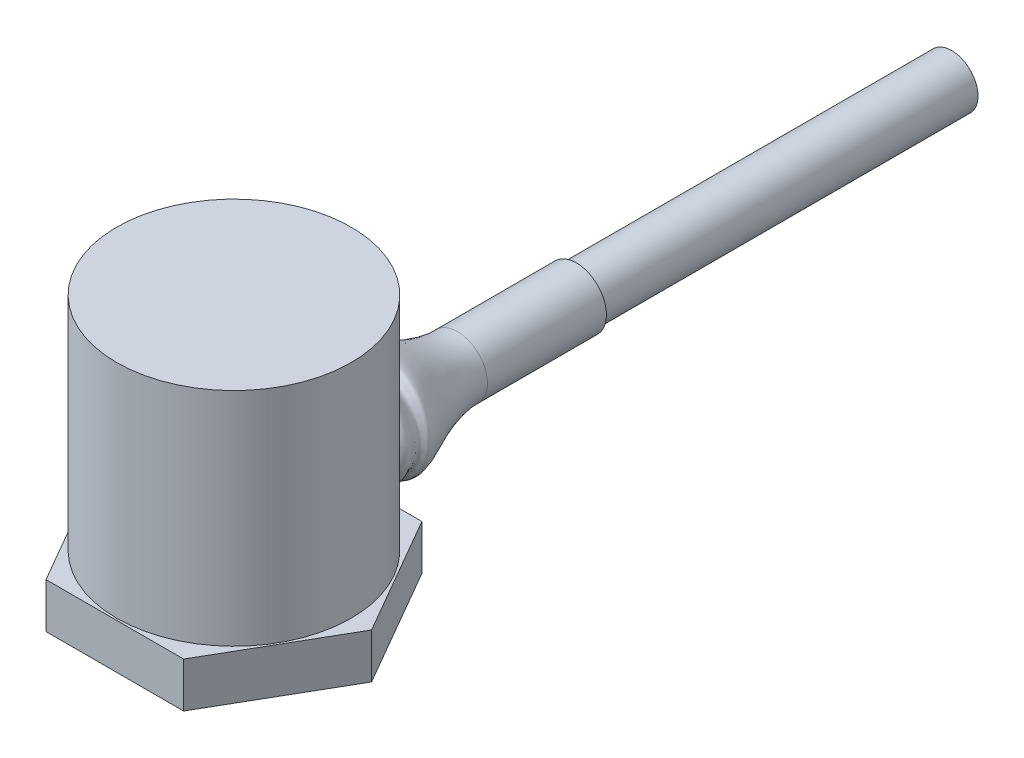
ISO-10303-21;
HEADER;
FILE_DESCRIPTION(('STEP AP214'),'2;1');
FILE_NAME('part.step','',(''),(''),'','','');
FILE_SCHEMA(('AUTOMOTIVE_DESIGN { 1 0 10303 214 1 1 1 1 }'));
ENDSEC;
DATA;
#1=APPLICATION_CONTEXT('core data for automotive mechanical design processes');
#2=APPLICATION_PROTOCOL_DEFINITION('international standard','automotive_design',2000,#1);
#3=PRODUCT_CONTEXT('',#1,'mechanical');
#4=PRODUCT('Part','Part','',(#3));
#5=PRODUCT_RELATED_PRODUCT_CATEGORY('part','',(#4));
#6=PRODUCT_DEFINITION_FORMATION('','',#4);
#7=PRODUCT_DEFINITION_CONTEXT('part definition',#1,'design');
#8=PRODUCT_DEFINITION('design','',#6,#7);
#9=PRODUCT_DEFINITION_SHAPE('','',#8);
#10=(LENGTH_UNIT() NAMED_UNIT(*) SI_UNIT(.MILLI.,.METRE.));
#11=(NAMED_UNIT(*) PLANE_ANGLE_UNIT() SI_UNIT($,.RADIAN.));
#12=(NAMED_UNIT(*) SI_UNIT($,.STERADIAN.) SOLID_ANGLE_UNIT());
#13=UNCERTAINTY_MEASURE_WITH_UNIT(LENGTH_MEASURE(1.E-05),#10,'distance_accuracy_value','');
#14=(GEOMETRIC_REPRESENTATION_CONTEXT(3) GLOBAL_UNCERTAINTY_ASSIGNED_CONTEXT((#13)) GLOBAL_UNIT_ASSIGNED_CONTEXT((#10,
#11,#12)) REPRESENTATION_CONTEXT('',''));
#15=CARTESIAN_POINT('',(0.,0.,0.));
#16=DIRECTION('',(0.,0.,1.));
#17=DIRECTION('',(1.,0.,0.));
#18=AXIS2_PLACEMENT_3D('',#15,#16,#17);
#19=CARTESIAN_POINT('',(0.,0.,-9.125));
#20=DIRECTION('',(0.,0.,1.));
#21=DIRECTION('',(1.,0.,0.));
#22=AXIS2_PLACEMENT_3D('',#19,#20,#21);
#23=PLANE('',#22);
#24=CARTESIAN_POINT('',(0.,2.475,-9.125));
#25=DIRECTION('',(0.,0.,1.));
#26=DIRECTION('',(1.,0.,0.));
#27=AXIS2_PLACEMENT_3D('',#24,#25,#26);
#28=CIRCLE('',#27,0.8);
#29=CARTESIAN_POINT('',(0.8,2.475,-9.125));
#30=VERTEX_POINT('',#29);
#31=EDGE_CURVE('E55',#30,#30,#28,.T.);
#32=ORIENTED_EDGE('',*,*,#31,.F.);
#33=EDGE_LOOP('',(#32));
#34=FACE_BOUND('',#33,.T.);
#35=CARTESIAN_POINT('',(0.,2.475,-9.125));
#36=DIRECTION('',(0.,0.,1.));
#37=DIRECTION('',(1.,0.,0.));
#38=AXIS2_PLACEMENT_3D('',#35,#36,#37);
#39=CIRCLE('',#38,0.7);
#40=CARTESIAN_POINT('',(0.7,2.475,-9.125));
#41=VERTEX_POINT('',#40);
#42=EDGE_CURVE('E11',#41,#41,#39,.F.);
#43=ORIENTED_EDGE('',*,*,#42,.F.);
#44=EDGE_LOOP('',(#43));
#45=FACE_BOUND('',#44,.T.);
#46=ADVANCED_FACE('F40',(#34,#45),#23,.F.);
#47=CARTESIAN_POINT('',(0.,2.475,-2.625));
#48=DIRECTION('',(0.,0.,1.));
#49=DIRECTION('',(1.,0.,0.));
#50=AXIS2_PLACEMENT_3D('',#47,#48,#49);
#51=CYLINDRICAL_SURFACE('',#50,1.275);
#52=CARTESIAN_POINT('',(0.,2.475,-3.125));
#53=DIRECTION('',(0.,0.,1.));
#54=DIRECTION('',(1.,0.,0.));
#55=AXIS2_PLACEMENT_3D('',#52,#53,#54);
#56=CIRCLE('',#55,1.275);
#57=CARTESIAN_POINT('',(1.275,2.475,-3.125));
#58=VERTEX_POINT('',#57);
#59=EDGE_CURVE('E47',#58,#58,#56,.T.);
#60=ORIENTED_EDGE('',*,*,#59,.T.);
#61=EDGE_LOOP('',(#60));
#62=FACE_BOUND('',#61,.T.);
#63=CARTESIAN_POINT('',(0.,2.475,-2.625));
#64=DIRECTION('',(0.,0.,1.));
#65=DIRECTION('',(1.,0.,0.));
#66=AXIS2_PLACEMENT_3D('',#63,#64,#65);
#67=CIRCLE('',#66,1.275);
#68=CARTESIAN_POINT('',(1.275,2.475,-2.625));
#69=VERTEX_POINT('',#68);
#70=EDGE_CURVE('E60',#69,#69,#67,.T.);
#71=ORIENTED_EDGE('',*,*,#70,.F.);
#72=EDGE_LOOP('',(#71));
#73=FACE_BOUND('',#72,.T.);
#74=ADVANCED_FACE('F42',(#62,#73),#51,.T.);
#75=CARTESIAN_POINT('',(0.,1.2,-3.125));
#76=CARTESIAN_POINT('',(0.,0.994577387408718,-3.30234172585024));
#77=CARTESIAN_POINT('',(0.,1.21280237493351,-3.43097267636331));
#78=CARTESIAN_POINT('',(0.,1.22107277897692,-3.71726330997462));
#79=CARTESIAN_POINT('',(0.,1.03747550346476,-3.75964524205374));
#80=CARTESIAN_POINT('',(0.,1.08981270276329,-4.02532274607695));
#81=CARTESIAN_POINT('',(0.,1.37340144468557,-4.67233424969552));
#82=CARTESIAN_POINT('',(0.,1.69183302924269,-5.36931226912087));
#83=CARTESIAN_POINT('',(0.,1.675,-5.95468658242071));
#84=B_SPLINE_CURVE_WITH_KNOTS('',3,(#75,#76,#77,#78,#79,#80,#81,#82,#83),.UNSPECIFIED.,.F.,.F.,
(4,1,1,1,1,1,4),(0.,0.1618892965205,0.198271220272997,0.247726197309799,0.302592126403118,
0.419245189738001,1.),.UNSPECIFIED.);
#85=CARTESIAN_POINT('',(0.,2.475,-2.625));
#86=DIRECTION('',(0.,0.,1.));
#87=AXIS1_PLACEMENT('',#85,#86);
#88=SURFACE_OF_REVOLUTION('',#84,#87);
#89=CARTESIAN_POINT('',(0.,2.475,-5.95468658242071));
#90=DIRECTION('',(0.,0.,1.));
#91=DIRECTION('',(1.,0.,0.));
#92=AXIS2_PLACEMENT_3D('',#89,#90,#91);
#93=CIRCLE('',#92,0.8);
#94=CARTESIAN_POINT('',(0.8,2.475,-5.95468658242071));
#95=VERTEX_POINT('',#94);
#96=EDGE_CURVE('E51',#95,#95,#93,.T.);
#97=ORIENTED_EDGE('',*,*,#96,.T.);
#98=EDGE_LOOP('',(#97));
#99=FACE_BOUND('',#98,.T.);
#100=ORIENTED_EDGE('',*,*,#59,.F.);
#101=EDGE_LOOP('',(#100));
#102=FACE_BOUND('',#101,.T.);
#103=ADVANCED_FACE('F71',(#99,#102),#88,.F.);
#104=CARTESIAN_POINT('',(0.,2.475,-2.625));
#105=DIRECTION('',(0.,0.,1.));
#106=DIRECTION('',(1.,0.,0.));
#107=AXIS2_PLACEMENT_3D('',#104,#105,#106);
#108=CYLINDRICAL_SURFACE('',#107,0.8);
#109=ORIENTED_EDGE('',*,*,#31,.T.);
#110=EDGE_LOOP('',(#109));
#111=FACE_BOUND('',#110,.T.);
#112=ORIENTED_EDGE('',*,*,#96,.F.);
#113=EDGE_LOOP('',(#112));
#114=FACE_BOUND('',#113,.T.);
#115=ADVANCED_FACE('F74',(#111,#114),#108,.T.);
#116=CARTESIAN_POINT('',(0.,0.,-2.625));
#117=DIRECTION('',(0.,0.,-1.));
#118=DIRECTION('',(-1.,0.,0.));
#119=AXIS2_PLACEMENT_3D('',#116,#117,#118);
#120=PLANE('',#119);
#121=ORIENTED_EDGE('',*,*,#70,.T.);
#122=EDGE_LOOP('',(#121));
#123=FACE_BOUND('',#122,.T.);
#124=ADVANCED_FACE('F78',(#123),#120,.F.);
#125=CARTESIAN_POINT('',(0.,2.475,-19.125));
#126=DIRECTION('',(0.,0.,1.));
#127=DIRECTION('',(1.,0.,0.));
#128=AXIS2_PLACEMENT_3D('',#125,#126,#127);
#129=CYLINDRICAL_SURFACE('',#128,0.7);
#130=CARTESIAN_POINT('',(0.,2.475,-19.125));
#131=DIRECTION('',(0.,0.,-1.));
#132=DIRECTION('',(-1.,0.,0.));
#133=AXIS2_PLACEMENT_3D('',#130,#131,#132);
#134=CIRCLE('',#133,0.7);
#135=CARTESIAN_POINT('',(-0.7,2.475,-19.125));
#136=VERTEX_POINT('',#135);
#137=EDGE_CURVE('E63',#136,#136,#134,.T.);
#138=ORIENTED_EDGE('',*,*,#137,.F.);
#139=EDGE_LOOP('',(#138));
#140=FACE_BOUND('',#139,.T.);
#141=ORIENTED_EDGE('',*,*,#42,.T.);
#142=EDGE_LOOP('',(#141));
#143=FACE_BOUND('',#142,.T.);
#144=ADVANCED_FACE('F85',(#140,#143),#129,.T.);
#145=CARTESIAN_POINT('',(0.,2.475,-19.125));
#146=DIRECTION('',(0.,0.,-1.));
#147=DIRECTION('',(-1.,0.,0.));
#148=AXIS2_PLACEMENT_3D('',#145,#146,#147);
#149=PLANE('',#148);
#150=ORIENTED_EDGE('',*,*,#137,.T.);
#151=EDGE_LOOP('',(#150));
#152=FACE_BOUND('',#151,.T.);
#153=ADVANCED_FACE('F89',(#152),#149,.T.);
#154=CLOSED_SHELL('',(#46,#74,#103,#115,#124,#144,#153));
#155=MANIFOLD_SOLID_BREP('B2',#154);
#156=CARTESIAN_POINT('',(0.,1.2,0.));
#157=DIRECTION('',(0.,1.,0.));
#158=DIRECTION('',(0.,0.,1.));
#159=AXIS2_PLACEMENT_3D('',#156,#157,#158);
#160=PLANE('',#159);
#161=DIRECTION('',(-0.499999999999992,0.,-0.866025403784443));
#162=VECTOR('',#161,1.);
#163=CARTESIAN_POINT('',(-2.74963065701561,1.2,1.58749999999997));
#164=LINE('',#163,#162);
#165=CARTESIAN_POINT('',(-1.83308710467708,1.2,3.175));
#166=VERTEX_POINT('',#165);
#167=CARTESIAN_POINT('',(-3.66617420935412,1.2,0.));
#168=VERTEX_POINT('',#167);
#169=EDGE_CURVE('E244',#166,#168,#164,.T.);
#170=ORIENTED_EDGE('',*,*,#169,.F.);
#171=DIRECTION('',(-1.,0.,0.));
#172=VECTOR('',#171,1.);
#173=CARTESIAN_POINT('',(0.,1.2,3.175));
#174=LINE('',#173,#172);
#175=CARTESIAN_POINT('',(1.83308710467705,1.2,3.175));
#176=VERTEX_POINT('',#175);
#177=EDGE_CURVE('E288',#176,#166,#174,.T.);
#178=ORIENTED_EDGE('',*,*,#177,.F.);
#179=DIRECTION('',(-0.500000000000004,0.,0.866025403784436));
#180=VECTOR('',#179,1.);
#181=CARTESIAN_POINT('',(2.74963065701559,1.2,1.58750000000001));
#182=LINE('',#181,#180);
#183=CARTESIAN_POINT('',(3.66617420935413,1.2,0.));
#184=VERTEX_POINT('',#183);
#185=EDGE_CURVE('E221',#184,#176,#182,.T.);
#186=ORIENTED_EDGE('',*,*,#185,.F.);
#187=DIRECTION('',(0.499999999999998,0.,0.86602540378444));
#188=VECTOR('',#187,1.);
#189=CARTESIAN_POINT('',(2.7496306570156,1.2,-1.58749999999999));
#190=LINE('',#189,#188);
#191=CARTESIAN_POINT('',(1.83308710467707,1.2,-3.175));
#192=VERTEX_POINT('',#191);
#193=EDGE_CURVE('E205',#192,#184,#190,.T.);
#194=ORIENTED_EDGE('',*,*,#193,.F.);
#195=DIRECTION('',(1.,0.,0.));
#196=VECTOR('',#195,1.);
#197=CARTESIAN_POINT('',(0.,1.2,-3.175));
#198=LINE('',#197,#196);
#199=CARTESIAN_POINT('',(-1.83308710467704,1.2,-3.175));
#200=VERTEX_POINT('',#199);
#201=EDGE_CURVE('E218',#200,#192,#198,.T.);
#202=ORIENTED_EDGE('',*,*,#201,.F.);
#203=DIRECTION('',(0.50000000000001,0.,-0.866025403784433));
#204=VECTOR('',#203,1.);
#205=CARTESIAN_POINT('',(-2.74963065701557,1.2,-1.58750000000003));
#206=LINE('',#205,#204);
#207=EDGE_CURVE('E224',#168,#200,#206,.T.);
#208=ORIENTED_EDGE('',*,*,#207,.F.);
#209=EDGE_LOOP('',(#170,#178,#186,#194,#202,#208));
#210=FACE_BOUND('',#209,.T.);
#211=CARTESIAN_POINT('',(0.,1.2,0.));
#212=DIRECTION('',(0.,1.,0.));
#213=DIRECTION('',(0.,0.,1.));
#214=AXIS2_PLACEMENT_3D('',#211,#212,#213);
#215=CIRCLE('',#214,3.125);
#216=CARTESIAN_POINT('',(0.,1.2,3.125));
#217=VERTEX_POINT('',#216);
#218=EDGE_CURVE('E282',#217,#217,#215,.T.);
#219=ORIENTED_EDGE('',*,*,#218,.F.);
#220=EDGE_LOOP('',(#219));
#221=FACE_BOUND('',#220,.T.);
#222=ADVANCED_FACE('F147',(#210,#221),#160,.T.);
#223=CARTESIAN_POINT('',(-2.74963065701561,1.2,1.58749999999997));
#224=DIRECTION('',(-0.866025403784443,0.,0.499999999999992));
#225=DIRECTION('',(0.499999999999992,0.,0.866025403784443));
#226=AXIS2_PLACEMENT_3D('',#223,#224,#225);
#227=PLANE('',#226);
#228=DIRECTION('',(-0.499999999999992,0.,-0.866025403784443));
#229=VECTOR('',#228,1.);
#230=CARTESIAN_POINT('',(-2.74963065701561,0.,1.58749999999997));
#231=LINE('',#230,#229);
#232=CARTESIAN_POINT('',(-1.83308710467708,0.,3.175));
#233=VERTEX_POINT('',#232);
#234=CARTESIAN_POINT('',(-3.66617420935412,0.,0.));
#235=VERTEX_POINT('',#234);
#236=EDGE_CURVE('E229',#233,#235,#231,.T.);
#237=ORIENTED_EDGE('',*,*,#236,.F.);
#238=DIRECTION('',(0.,-1.,0.));
#239=VECTOR('',#238,1.);
#240=CARTESIAN_POINT('',(-1.83308710467708,1.2,3.175));
#241=LINE('',#240,#239);
#242=EDGE_CURVE('E38',#166,#233,#241,.T.);
#243=ORIENTED_EDGE('',*,*,#242,.F.);
#244=ORIENTED_EDGE('',*,*,#169,.T.);
#245=DIRECTION('',(0.,-1.,0.));
#246=VECTOR('',#245,1.);
#247=CARTESIAN_POINT('',(-3.66617420935412,1.2,0.));
#248=LINE('',#247,#246);
#249=EDGE_CURVE('E164',#168,#235,#248,.T.);
#250=ORIENTED_EDGE('',*,*,#249,.T.);
#251=EDGE_LOOP('',(#237,#243,#244,#250));
#252=FACE_BOUND('',#251,.T.);
#253=ADVANCED_FACE('F149',(#252),#227,.T.);
#254=CARTESIAN_POINT('',(0.,1.2,3.175));
#255=DIRECTION('',(0.,0.,1.));
#256=DIRECTION('',(1.,0.,0.));
#257=AXIS2_PLACEMENT_3D('',#254,#255,#256);
#258=PLANE('',#257);
#259=DIRECTION('',(-1.,0.,0.));
#260=VECTOR('',#259,1.);
#261=CARTESIAN_POINT('',(0.,0.,3.175));
#262=LINE('',#261,#260);
#263=CARTESIAN_POINT('',(1.83308710467705,0.,3.175));
#264=VERTEX_POINT('',#263);
#265=EDGE_CURVE('E231',#264,#233,#262,.T.);
#266=ORIENTED_EDGE('',*,*,#265,.F.);
#267=DIRECTION('',(0.,-1.,0.));
#268=VECTOR('',#267,1.);
#269=CARTESIAN_POINT('',(1.83308710467705,1.2,3.175));
#270=LINE('',#269,#268);
#271=EDGE_CURVE('E156',#176,#264,#270,.T.);
#272=ORIENTED_EDGE('',*,*,#271,.F.);
#273=ORIENTED_EDGE('',*,*,#177,.T.);
#274=ORIENTED_EDGE('',*,*,#242,.T.);
#275=EDGE_LOOP('',(#266,#272,#273,#274));
#276=FACE_BOUND('',#275,.T.);
#277=ADVANCED_FACE('F253',(#276),#258,.T.);
#278=CARTESIAN_POINT('',(2.74963065701559,1.2,1.58750000000001));
#279=DIRECTION('',(0.866025403784436,0.,0.500000000000004));
#280=DIRECTION('',(0.500000000000004,0.,-0.866025403784436));
#281=AXIS2_PLACEMENT_3D('',#278,#279,#280);
#282=PLANE('',#281);
#283=DIRECTION('',(-0.500000000000004,0.,0.866025403784436));
#284=VECTOR('',#283,1.);
#285=CARTESIAN_POINT('',(2.74963065701559,0.,1.58750000000001));
#286=LINE('',#285,#284);
#287=CARTESIAN_POINT('',(3.66617420935413,0.,0.));
#288=VERTEX_POINT('',#287);
#289=EDGE_CURVE('E235',#288,#264,#286,.T.);
#290=ORIENTED_EDGE('',*,*,#289,.F.);
#291=DIRECTION('',(0.,-1.,0.));
#292=VECTOR('',#291,1.);
#293=CARTESIAN_POINT('',(3.66617420935413,1.2,0.));
#294=LINE('',#293,#292);
#295=EDGE_CURVE('E211',#184,#288,#294,.T.);
#296=ORIENTED_EDGE('',*,*,#295,.F.);
#297=ORIENTED_EDGE('',*,*,#185,.T.);
#298=ORIENTED_EDGE('',*,*,#271,.T.);
#299=EDGE_LOOP('',(#290,#296,#297,#298));
#300=FACE_BOUND('',#299,.T.);
#301=ADVANCED_FACE('F250',(#300),#282,.T.);
#302=CARTESIAN_POINT('',(2.7496306570156,1.2,-1.58749999999999));
#303=DIRECTION('',(0.86602540378444,0.,-0.499999999999998));
#304=DIRECTION('',(-0.499999999999998,0.,-0.86602540378444));
#305=AXIS2_PLACEMENT_3D('',#302,#303,#304);
#306=PLANE('',#305);
#307=DIRECTION('',(0.499999999999998,0.,0.86602540378444));
#308=VECTOR('',#307,1.);
#309=CARTESIAN_POINT('',(2.7496306570156,0.,-1.58749999999999));
#310=LINE('',#309,#308);
#311=CARTESIAN_POINT('',(1.83308710467707,0.,-3.175));
#312=VERTEX_POINT('',#311);
#313=EDGE_CURVE('E207',#312,#288,#310,.T.);
#314=ORIENTED_EDGE('',*,*,#313,.F.);
#315=DIRECTION('',(0.,-1.,0.));
#316=VECTOR('',#315,1.);
#317=CARTESIAN_POINT('',(1.83308710467707,1.2,-3.175));
#318=LINE('',#317,#316);
#319=EDGE_CURVE('E202',#192,#312,#318,.T.);
#320=ORIENTED_EDGE('',*,*,#319,.F.);
#321=ORIENTED_EDGE('',*,*,#193,.T.);
#322=ORIENTED_EDGE('',*,*,#295,.T.);
#323=EDGE_LOOP('',(#314,#320,#321,#322));
#324=FACE_BOUND('',#323,.T.);
#325=ADVANCED_FACE('F204',(#324),#306,.T.);
#326=CARTESIAN_POINT('',(0.,1.2,-3.175));
#327=DIRECTION('',(0.,0.,-1.));
#328=DIRECTION('',(-1.,0.,0.));
#329=AXIS2_PLACEMENT_3D('',#326,#327,#328);
#330=PLANE('',#329);
#331=DIRECTION('',(1.,0.,0.));
#332=VECTOR('',#331,1.);
#333=CARTESIAN_POINT('',(0.,0.,-3.175));
#334=LINE('',#333,#332);
#335=CARTESIAN_POINT('',(-1.83308710467704,0.,-3.175));
#336=VERTEX_POINT('',#335);
#337=EDGE_CURVE('E239',#336,#312,#334,.T.);
#338=ORIENTED_EDGE('',*,*,#337,.F.);
#339=DIRECTION('',(0.,-1.,0.));
#340=VECTOR('',#339,1.);
#341=CARTESIAN_POINT('',(-1.83308710467704,1.2,-3.175));
#342=LINE('',#341,#340);
#343=EDGE_CURVE('E183',#200,#336,#342,.T.);
#344=ORIENTED_EDGE('',*,*,#343,.F.);
#345=ORIENTED_EDGE('',*,*,#201,.T.);
#346=ORIENTED_EDGE('',*,*,#319,.T.);
#347=EDGE_LOOP('',(#338,#344,#345,#346));
#348=FACE_BOUND('',#347,.T.);
#349=ADVANCED_FACE('F223',(#348),#330,.T.);
#350=CARTESIAN_POINT('',(-2.74963065701557,1.2,-1.58750000000003));
#351=DIRECTION('',(-0.866025403784433,0.,-0.50000000000001));
#352=DIRECTION('',(-0.50000000000001,0.,0.866025403784433));
#353=AXIS2_PLACEMENT_3D('',#350,#351,#352);
#354=PLANE('',#353);
#355=DIRECTION('',(0.50000000000001,0.,-0.866025403784433));
#356=VECTOR('',#355,1.);
#357=CARTESIAN_POINT('',(-2.74963065701557,0.,-1.58750000000003));
#358=LINE('',#357,#356);
#359=EDGE_CURVE('E241',#235,#336,#358,.T.);
#360=ORIENTED_EDGE('',*,*,#359,.F.);
#361=ORIENTED_EDGE('',*,*,#249,.F.);
#362=ORIENTED_EDGE('',*,*,#207,.T.);
#363=ORIENTED_EDGE('',*,*,#343,.T.);
#364=EDGE_LOOP('',(#360,#361,#362,#363));
#365=FACE_BOUND('',#364,.T.);
#366=ADVANCED_FACE('F256',(#365),#354,.T.);
#367=CARTESIAN_POINT('',(0.,0.,0.));
#368=DIRECTION('',(0.,1.,0.));
#369=DIRECTION('',(0.,0.,1.));
#370=AXIS2_PLACEMENT_3D('',#367,#368,#369);
#371=PLANE('',#370);
#372=ORIENTED_EDGE('',*,*,#236,.T.);
#373=ORIENTED_EDGE('',*,*,#359,.T.);
#374=ORIENTED_EDGE('',*,*,#337,.T.);
#375=ORIENTED_EDGE('',*,*,#313,.T.);
#376=ORIENTED_EDGE('',*,*,#289,.T.);
#377=ORIENTED_EDGE('',*,*,#265,.T.);
#378=EDGE_LOOP('',(#372,#373,#374,#375,#376,#377));
#379=FACE_BOUND('',#378,.T.);
#380=ADVANCED_FACE('F255',(#379),#371,.F.);
#381=CARTESIAN_POINT('',(0.,7.1,0.));
#382=DIRECTION('',(0.,-1.,0.));
#383=DIRECTION('',(0.,0.,-1.));
#384=AXIS2_PLACEMENT_3D('',#381,#382,#383);
#385=CYLINDRICAL_SURFACE('',#384,3.125);
#386=CARTESIAN_POINT('',(0.,7.1,0.));
#387=DIRECTION('',(0.,1.,0.));
#388=DIRECTION('',(0.,0.,1.));
#389=AXIS2_PLACEMENT_3D('',#386,#387,#388);
#390=CIRCLE('',#389,3.125);
#391=CARTESIAN_POINT('',(0.,7.1,3.125));
#392=VERTEX_POINT('',#391);
#393=EDGE_CURVE('E232',#392,#392,#390,.T.);
#394=ORIENTED_EDGE('',*,*,#393,.F.);
#395=EDGE_LOOP('',(#394));
#396=FACE_BOUND('',#395,.T.);
#397=ORIENTED_EDGE('',*,*,#218,.T.);
#398=EDGE_LOOP('',(#397));
#399=FACE_BOUND('',#398,.T.);
#400=ADVANCED_FACE('F263',(#396,#399),#385,.T.);
#401=CARTESIAN_POINT('',(0.,7.1,0.));
#402=DIRECTION('',(0.,1.,0.));
#403=DIRECTION('',(0.,0.,1.));
#404=AXIS2_PLACEMENT_3D('',#401,#402,#403);
#405=PLANE('',#404);
#406=ORIENTED_EDGE('',*,*,#393,.T.);
#407=EDGE_LOOP('',(#406));
#408=FACE_BOUND('',#407,.T.);
#409=ADVANCED_FACE('F274',(#408),#405,.T.);
#410=CLOSED_SHELL('',(#222,#253,#277,#301,#325,#349,#366,#380,#400,#409));
#411=MANIFOLD_SOLID_BREP('B6',#410);
#412=ADVANCED_BREP_SHAPE_REPRESENTATION('',(#18,#155,#411),#14);
#413=SHAPE_DEFINITION_REPRESENTATION(#9,#412);
ENDSEC;
END-ISO-10303-21;
